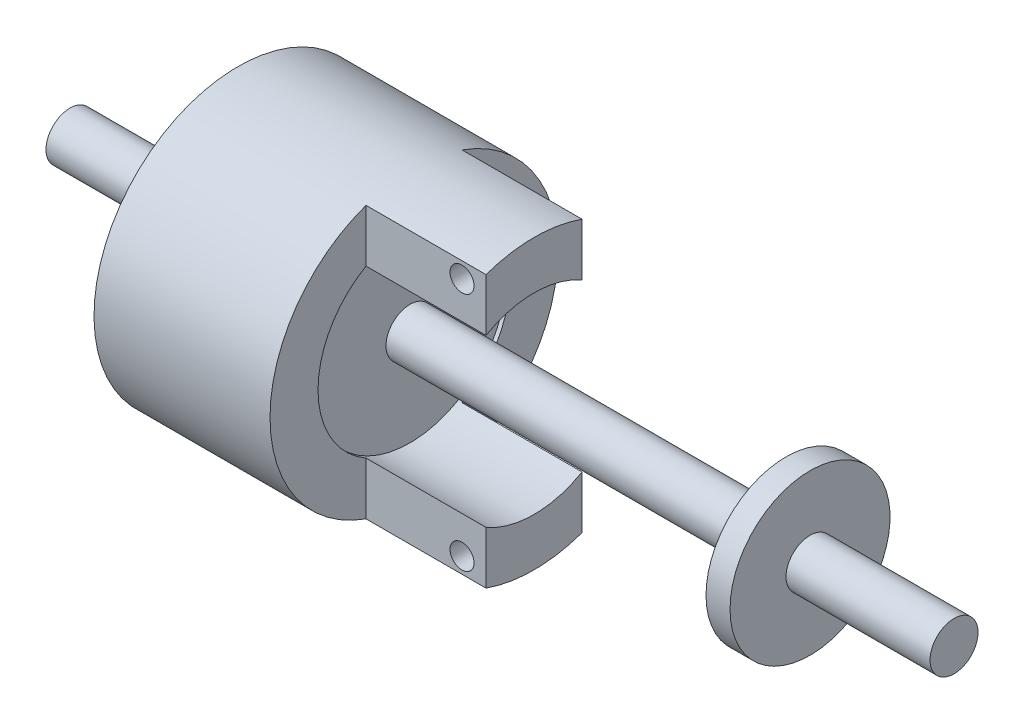
ISO-10303-21;
HEADER;
FILE_DESCRIPTION(('STEP AP214'),'2;1');
FILE_NAME('part.step','',(''),(''),'','','');
FILE_SCHEMA(('AUTOMOTIVE_DESIGN { 1 0 10303 214 1 1 1 1 }'));
ENDSEC;
DATA;
#1=APPLICATION_CONTEXT('core data for automotive mechanical design processes');
#2=APPLICATION_PROTOCOL_DEFINITION('international standard','automotive_design',2000,#1);
#3=PRODUCT_CONTEXT('',#1,'mechanical');
#4=PRODUCT('Part','Part','',(#3));
#5=PRODUCT_RELATED_PRODUCT_CATEGORY('part','',(#4));
#6=PRODUCT_DEFINITION_FORMATION('','',#4);
#7=PRODUCT_DEFINITION_CONTEXT('part definition',#1,'design');
#8=PRODUCT_DEFINITION('design','',#6,#7);
#9=PRODUCT_DEFINITION_SHAPE('','',#8);
#10=(LENGTH_UNIT() NAMED_UNIT(*) SI_UNIT(.MILLI.,.METRE.));
#11=(NAMED_UNIT(*) PLANE_ANGLE_UNIT() SI_UNIT($,.RADIAN.));
#12=(NAMED_UNIT(*) SI_UNIT($,.STERADIAN.) SOLID_ANGLE_UNIT());
#13=UNCERTAINTY_MEASURE_WITH_UNIT(LENGTH_MEASURE(1.E-05),#10,'distance_accuracy_value','');
#14=(GEOMETRIC_REPRESENTATION_CONTEXT(3) GLOBAL_UNCERTAINTY_ASSIGNED_CONTEXT((#13)) GLOBAL_UNIT_ASSIGNED_CONTEXT((#10,
#11,#12)) REPRESENTATION_CONTEXT('',''));
#15=CARTESIAN_POINT('',(0.,0.,0.));
#16=DIRECTION('',(0.,0.,1.));
#17=DIRECTION('',(1.,0.,0.));
#18=AXIS2_PLACEMENT_3D('',#15,#16,#17);
#19=CARTESIAN_POINT('',(-55.,3.,-3.));
#20=DIRECTION('',(-1.,0.,0.));
#21=DIRECTION('',(0.,-1.,0.));
#22=AXIS2_PLACEMENT_3D('',#19,#20,#21);
#23=PLANE('',#22);
#24=CARTESIAN_POINT('',(-55.,0.,0.));
#25=DIRECTION('',(-1.,0.,0.));
#26=DIRECTION('',(0.,0.,1.));
#27=AXIS2_PLACEMENT_3D('',#24,#25,#26);
#28=CIRCLE('',#27,3.);
#29=CARTESIAN_POINT('',(-55.,0.,3.));
#30=VERTEX_POINT('',#29);
#31=EDGE_CURVE('E20',#30,#30,#28,.T.);
#32=ORIENTED_EDGE('',*,*,#31,.T.);
#33=EDGE_LOOP('',(#32));
#34=FACE_BOUND('',#33,.T.);
#35=ADVANCED_FACE('F16',(#34),#23,.T.);
#36=CARTESIAN_POINT('',(-36.,0.,0.));
#37=DIRECTION('',(-1.,0.,0.));
#38=DIRECTION('',(0.,0.,1.));
#39=AXIS2_PLACEMENT_3D('',#36,#37,#38);
#40=CYLINDRICAL_SURFACE('',#39,3.);
#41=CARTESIAN_POINT('',(-36.,0.,0.));
#42=DIRECTION('',(-1.,0.,0.));
#43=DIRECTION('',(0.,0.,1.));
#44=AXIS2_PLACEMENT_3D('',#41,#42,#43);
#45=CIRCLE('',#44,3.);
#46=CARTESIAN_POINT('',(-36.,0.,3.));
#47=VERTEX_POINT('',#46);
#48=EDGE_CURVE('E193',#47,#47,#45,.F.);
#49=ORIENTED_EDGE('',*,*,#48,.F.);
#50=EDGE_LOOP('',(#49));
#51=FACE_BOUND('',#50,.T.);
#52=ORIENTED_EDGE('',*,*,#31,.F.);
#53=EDGE_LOOP('',(#52));
#54=FACE_BOUND('',#53,.T.);
#55=ADVANCED_FACE('F201',(#51,#54),#40,.T.);
#56=CARTESIAN_POINT('',(-36.,4.,-4.));
#57=DIRECTION('',(-1.,0.,0.));
#58=DIRECTION('',(0.,-1.,0.));
#59=AXIS2_PLACEMENT_3D('',#56,#57,#58);
#60=PLANE('',#59);
#61=ORIENTED_EDGE('',*,*,#48,.T.);
#62=EDGE_LOOP('',(#61));
#63=FACE_BOUND('',#62,.T.);
#64=CARTESIAN_POINT('',(-36.,0.,0.));
#65=DIRECTION('',(-1.,0.,0.));
#66=DIRECTION('',(0.,0.,1.));
#67=AXIS2_PLACEMENT_3D('',#64,#65,#66);
#68=CIRCLE('',#67,4.);
#69=CARTESIAN_POINT('',(-36.,0.,4.));
#70=VERTEX_POINT('',#69);
#71=EDGE_CURVE('E190',#70,#70,#68,.T.);
#72=ORIENTED_EDGE('',*,*,#71,.T.);
#73=EDGE_LOOP('',(#72));
#74=FACE_BOUND('',#73,.T.);
#75=ADVANCED_FACE('F203',(#63,#74),#60,.T.);
#76=CARTESIAN_POINT('',(-35.,0.,0.));
#77=DIRECTION('',(-1.,0.,0.));
#78=DIRECTION('',(0.,0.,1.));
#79=AXIS2_PLACEMENT_3D('',#76,#77,#78);
#80=CYLINDRICAL_SURFACE('',#79,4.);
#81=CARTESIAN_POINT('',(-35.,0.,0.));
#82=DIRECTION('',(-1.,0.,0.));
#83=DIRECTION('',(0.,0.,1.));
#84=AXIS2_PLACEMENT_3D('',#81,#82,#83);
#85=CIRCLE('',#84,4.);
#86=CARTESIAN_POINT('',(-35.,0.,4.));
#87=VERTEX_POINT('',#86);
#88=EDGE_CURVE('E187',#87,#87,#85,.F.);
#89=ORIENTED_EDGE('',*,*,#88,.F.);
#90=EDGE_LOOP('',(#89));
#91=FACE_BOUND('',#90,.T.);
#92=ORIENTED_EDGE('',*,*,#71,.F.);
#93=EDGE_LOOP('',(#92));
#94=FACE_BOUND('',#93,.T.);
#95=ADVANCED_FACE('F211',(#91,#94),#80,.T.);
#96=CARTESIAN_POINT('',(-35.,12.,-12.));
#97=DIRECTION('',(-1.,0.,0.));
#98=DIRECTION('',(0.,-1.,0.));
#99=AXIS2_PLACEMENT_3D('',#96,#97,#98);
#100=PLANE('',#99);
#101=ORIENTED_EDGE('',*,*,#88,.T.);
#102=EDGE_LOOP('',(#101));
#103=FACE_BOUND('',#102,.T.);
#104=CARTESIAN_POINT('',(-35.,0.,0.));
#105=DIRECTION('',(1.,0.,0.));
#106=DIRECTION('',(0.,0.,-1.));
#107=AXIS2_PLACEMENT_3D('',#104,#105,#106);
#108=CIRCLE('',#107,12.);
#109=CARTESIAN_POINT('',(-35.,0.,-12.));
#110=VERTEX_POINT('',#109);
#111=EDGE_CURVE('E184',#110,#110,#108,.F.);
#112=ORIENTED_EDGE('',*,*,#111,.T.);
#113=EDGE_LOOP('',(#112));
#114=FACE_BOUND('',#113,.T.);
#115=ADVANCED_FACE('F287',(#103,#114),#100,.T.);
#116=CARTESIAN_POINT('',(-34.,0.,0.));
#117=DIRECTION('',(1.,0.,0.));
#118=DIRECTION('',(0.,0.,-1.));
#119=AXIS2_PLACEMENT_3D('',#116,#117,#118);
#120=CONICAL_SURFACE('',#119,18.,1.40564764938027);
#121=CARTESIAN_POINT('',(-34.,0.,0.));
#122=DIRECTION('',(-1.,0.,0.));
#123=DIRECTION('',(0.,-1.,0.));
#124=AXIS2_PLACEMENT_3D('',#121,#122,#123);
#125=CIRCLE('',#124,18.);
#126=CARTESIAN_POINT('',(-34.,-18.,0.));
#127=VERTEX_POINT('',#126);
#128=EDGE_CURVE('E101',#127,#127,#125,.T.);
#129=ORIENTED_EDGE('',*,*,#128,.T.);
#130=EDGE_LOOP('',(#129));
#131=FACE_BOUND('',#130,.T.);
#132=ORIENTED_EDGE('',*,*,#111,.F.);
#133=EDGE_LOOP('',(#132));
#134=FACE_BOUND('',#133,.T.);
#135=ADVANCED_FACE('F289',(#131,#134),#120,.T.);
#136=CARTESIAN_POINT('',(0.,15.,-6.));
#137=DIRECTION('',(0.,0.,1.));
#138=DIRECTION('',(1.,0.,0.));
#139=AXIS2_PLACEMENT_3D('',#136,#137,#138);
#140=CYLINDRICAL_SURFACE('',#139,1.5);
#141=CARTESIAN_POINT('',(0.,15.,6.));
#142=DIRECTION('',(0.,0.,1.));
#143=DIRECTION('',(1.,0.,0.));
#144=AXIS2_PLACEMENT_3D('',#141,#142,#143);
#145=CIRCLE('',#144,1.5);
#146=CARTESIAN_POINT('',(1.5,15.,6.));
#147=VERTEX_POINT('',#146);
#148=EDGE_CURVE('E139',#147,#147,#145,.T.);
#149=ORIENTED_EDGE('',*,*,#148,.T.);
#150=EDGE_LOOP('',(#149));
#151=FACE_BOUND('',#150,.T.);
#152=CARTESIAN_POINT('',(0.,15.,-6.));
#153=DIRECTION('',(0.,0.,1.));
#154=DIRECTION('',(1.,0.,0.));
#155=AXIS2_PLACEMENT_3D('',#152,#153,#154);
#156=CIRCLE('',#155,1.5);
#157=CARTESIAN_POINT('',(1.5,15.,-6.));
#158=VERTEX_POINT('',#157);
#159=EDGE_CURVE('E116',#158,#158,#156,.F.);
#160=ORIENTED_EDGE('',*,*,#159,.T.);
#161=EDGE_LOOP('',(#160));
#162=FACE_BOUND('',#161,.T.);
#163=ADVANCED_FACE('F300',(#151,#162),#140,.F.);
#164=CARTESIAN_POINT('',(0.,-15.,-6.));
#165=DIRECTION('',(0.,0.,1.));
#166=DIRECTION('',(1.,0.,0.));
#167=AXIS2_PLACEMENT_3D('',#164,#165,#166);
#168=CYLINDRICAL_SURFACE('',#167,1.5);
#169=CARTESIAN_POINT('',(0.,-15.,6.));
#170=DIRECTION('',(0.,0.,1.));
#171=DIRECTION('',(1.,0.,0.));
#172=AXIS2_PLACEMENT_3D('',#169,#170,#171);
#173=CIRCLE('',#172,1.5);
#174=CARTESIAN_POINT('',(1.5,-15.,6.));
#175=VERTEX_POINT('',#174);
#176=EDGE_CURVE('E125',#175,#175,#173,.T.);
#177=ORIENTED_EDGE('',*,*,#176,.T.);
#178=EDGE_LOOP('',(#177));
#179=FACE_BOUND('',#178,.T.);
#180=CARTESIAN_POINT('',(0.,-15.,-6.));
#181=DIRECTION('',(0.,0.,1.));
#182=DIRECTION('',(1.,0.,0.));
#183=AXIS2_PLACEMENT_3D('',#180,#181,#182);
#184=CIRCLE('',#183,1.5);
#185=CARTESIAN_POINT('',(1.5,-15.,-6.));
#186=VERTEX_POINT('',#185);
#187=EDGE_CURVE('E92',#186,#186,#184,.F.);
#188=ORIENTED_EDGE('',*,*,#187,.T.);
#189=EDGE_LOOP('',(#188));
#190=FACE_BOUND('',#189,.T.);
#191=ADVANCED_FACE('F297',(#179,#190),#168,.F.);
#192=CARTESIAN_POINT('',(3.,0.,0.));
#193=DIRECTION('',(-1.,0.,0.));
#194=DIRECTION('',(0.,0.,1.));
#195=AXIS2_PLACEMENT_3D('',#192,#193,#194);
#196=CYLINDRICAL_SURFACE('',#195,18.);
#197=CARTESIAN_POINT('',(3.,0.,0.));
#198=DIRECTION('',(-1.,0.,0.));
#199=DIRECTION('',(0.,0.,1.));
#200=AXIS2_PLACEMENT_3D('',#197,#198,#199);
#201=CIRCLE('',#200,18.);
#202=CARTESIAN_POINT('',(3.,-16.9705627484771,6.));
#203=VERTEX_POINT('',#202);
#204=CARTESIAN_POINT('',(3.,-16.9705627484771,-5.99999999999994));
#205=VERTEX_POINT('',#204);
#206=EDGE_CURVE('E123',#203,#205,#201,.F.);
#207=ORIENTED_EDGE('',*,*,#206,.F.);
#208=DIRECTION('',(-1.,0.,0.));
#209=VECTOR('',#208,1.);
#210=CARTESIAN_POINT('',(-13.970562748477,-16.970562748477,6.));
#211=LINE('',#210,#209);
#212=CARTESIAN_POINT('',(-12.,-16.9705627484771,6.));
#213=VERTEX_POINT('',#212);
#214=EDGE_CURVE('E119',#203,#213,#211,.T.);
#215=ORIENTED_EDGE('',*,*,#214,.T.);
#216=CARTESIAN_POINT('',(-12.0000000000002,0.,0.));
#217=DIRECTION('',(-1.,0.,0.));
#218=DIRECTION('',(0.,0.,1.));
#219=AXIS2_PLACEMENT_3D('',#216,#217,#218);
#220=CIRCLE('',#219,18.);
#221=CARTESIAN_POINT('',(-12.0000000000001,16.9705627484771,6.00000000000009));
#222=VERTEX_POINT('',#221);
#223=EDGE_CURVE('E120',#213,#222,#220,.T.);
#224=ORIENTED_EDGE('',*,*,#223,.T.);
#225=DIRECTION('',(1.,0.,0.));
#226=VECTOR('',#225,1.);
#227=CARTESIAN_POINT('',(-13.970562748477,16.970562748477,6.));
#228=LINE('',#227,#226);
#229=CARTESIAN_POINT('',(3.,16.9705627484771,6.));
#230=VERTEX_POINT('',#229);
#231=EDGE_CURVE('E140',#222,#230,#228,.T.);
#232=ORIENTED_EDGE('',*,*,#231,.T.);
#233=CARTESIAN_POINT('',(3.,0.,0.));
#234=DIRECTION('',(-1.,0.,0.));
#235=DIRECTION('',(0.,0.,1.));
#236=AXIS2_PLACEMENT_3D('',#233,#234,#235);
#237=CIRCLE('',#236,18.);
#238=CARTESIAN_POINT('',(3.,16.9705627484771,-5.99999999999994));
#239=VERTEX_POINT('',#238);
#240=EDGE_CURVE('E115',#239,#230,#237,.F.);
#241=ORIENTED_EDGE('',*,*,#240,.F.);
#242=DIRECTION('',(-1.,0.,0.));
#243=VECTOR('',#242,1.);
#244=CARTESIAN_POINT('',(-13.970562748477,16.970562748477,-6.));
#245=LINE('',#244,#243);
#246=CARTESIAN_POINT('',(-12.,16.9705627484771,-6.));
#247=VERTEX_POINT('',#246);
#248=EDGE_CURVE('E80',#239,#247,#245,.T.);
#249=ORIENTED_EDGE('',*,*,#248,.T.);
#250=CARTESIAN_POINT('',(-12.0000000000002,0.,0.));
#251=DIRECTION('',(-1.,0.,0.));
#252=DIRECTION('',(0.,0.,1.));
#253=AXIS2_PLACEMENT_3D('',#250,#251,#252);
#254=CIRCLE('',#253,18.);
#255=CARTESIAN_POINT('',(-12.0000000000001,-16.970562748477,-6.0000000000001));
#256=VERTEX_POINT('',#255);
#257=EDGE_CURVE('E82',#247,#256,#254,.T.);
#258=ORIENTED_EDGE('',*,*,#257,.T.);
#259=DIRECTION('',(1.,0.,0.));
#260=VECTOR('',#259,1.);
#261=CARTESIAN_POINT('',(-13.970562748477,-16.970562748477,-6.));
#262=LINE('',#261,#260);
#263=EDGE_CURVE('E86',#256,#205,#262,.T.);
#264=ORIENTED_EDGE('',*,*,#263,.T.);
#265=EDGE_LOOP('',(#207,#215,#224,#232,#241,#249,#258,#264));
#266=FACE_BOUND('',#265,.T.);
#267=ORIENTED_EDGE('',*,*,#128,.F.);
#268=EDGE_LOOP('',(#267));
#269=FACE_BOUND('',#268,.T.);
#270=ADVANCED_FACE('F84',(#266,#269),#196,.T.);
#271=CARTESIAN_POINT('',(3.,16.970562748477,-6.));
#272=DIRECTION('',(0.,0.,1.));
#273=DIRECTION('',(-1.,0.,0.));
#274=AXIS2_PLACEMENT_3D('',#271,#272,#273);
#275=PLANE('',#274);
#276=ORIENTED_EDGE('',*,*,#187,.F.);
#277=EDGE_LOOP('',(#276));
#278=FACE_BOUND('',#277,.T.);
#279=ORIENTED_EDGE('',*,*,#263,.F.);
#280=DIRECTION('',(0.,1.,0.));
#281=VECTOR('',#280,1.);
#282=CARTESIAN_POINT('',(-12.,1.029437251523,-6.00000000000013));
#283=LINE('',#282,#281);
#284=CARTESIAN_POINT('',(-11.9999999999998,-10.3923048454133,-6.00000000000006));
#285=VERTEX_POINT('',#284);
#286=EDGE_CURVE('E91',#256,#285,#283,.T.);
#287=ORIENTED_EDGE('',*,*,#286,.T.);
#288=DIRECTION('',(-1.,0.,0.));
#289=VECTOR('',#288,1.);
#290=CARTESIAN_POINT('',(-4.751357719302,-10.3923048454133,-5.99999999999988));
#291=LINE('',#290,#289);
#292=CARTESIAN_POINT('',(3.,-10.3923048454133,-5.99999999999988));
#293=VERTEX_POINT('',#292);
#294=EDGE_CURVE('E122',#293,#285,#291,.T.);
#295=ORIENTED_EDGE('',*,*,#294,.F.);
#296=DIRECTION('',(0.,1.,0.));
#297=VECTOR('',#296,1.);
#298=CARTESIAN_POINT('',(3.,0.,-5.99999999999988));
#299=LINE('',#298,#297);
#300=EDGE_CURVE('E99',#205,#293,#299,.T.);
#301=ORIENTED_EDGE('',*,*,#300,.F.);
#302=EDGE_LOOP('',(#279,#287,#295,#301));
#303=FACE_BOUND('',#302,.T.);
#304=ADVANCED_FACE('F95',(#278,#303),#275,.F.);
#305=CARTESIAN_POINT('',(-12.,-16.970562748477,18.));
#306=DIRECTION('',(-1.,0.,0.));
#307=DIRECTION('',(0.,1.,0.));
#308=AXIS2_PLACEMENT_3D('',#305,#306,#307);
#309=PLANE('',#308);
#310=CARTESIAN_POINT('',(-11.9999999999997,0.,0.));
#311=DIRECTION('',(-1.,0.,0.));
#312=DIRECTION('',(0.,0.,1.));
#313=AXIS2_PLACEMENT_3D('',#310,#311,#312);
#314=CIRCLE('',#313,12.);
#315=CARTESIAN_POINT('',(-11.9999999999997,10.3923048454132,-6.00000000000002));
#316=VERTEX_POINT('',#315);
#317=EDGE_CURVE('E105',#285,#316,#314,.F.);
#318=ORIENTED_EDGE('',*,*,#317,.F.);
#319=ORIENTED_EDGE('',*,*,#286,.F.);
#320=ORIENTED_EDGE('',*,*,#257,.F.);
#321=DIRECTION('',(0.,-1.,0.));
#322=VECTOR('',#321,1.);
#323=CARTESIAN_POINT('',(-11.9999999999998,0.,-6.));
#324=LINE('',#323,#322);
#325=EDGE_CURVE('E108',#247,#316,#324,.T.);
#326=ORIENTED_EDGE('',*,*,#325,.T.);
#327=EDGE_LOOP('',(#318,#319,#320,#326));
#328=FACE_BOUND('',#327,.T.);
#329=ADVANCED_FACE('F103',(#328),#309,.F.);
#330=CARTESIAN_POINT('',(3.,16.970562748477,-6.));
#331=DIRECTION('',(0.,0.,1.));
#332=DIRECTION('',(-1.,0.,0.));
#333=AXIS2_PLACEMENT_3D('',#330,#331,#332);
#334=PLANE('',#333);
#335=ORIENTED_EDGE('',*,*,#159,.F.);
#336=EDGE_LOOP('',(#335));
#337=FACE_BOUND('',#336,.T.);
#338=DIRECTION('',(1.,0.,0.));
#339=VECTOR('',#338,1.);
#340=CARTESIAN_POINT('',(-4.751357719302,10.3923048454132,-6.00000000000008));
#341=LINE('',#340,#339);
#342=CARTESIAN_POINT('',(3.,10.3923048454133,-5.99999999999998));
#343=VERTEX_POINT('',#342);
#344=EDGE_CURVE('E141',#316,#343,#341,.T.);
#345=ORIENTED_EDGE('',*,*,#344,.F.);
#346=ORIENTED_EDGE('',*,*,#325,.F.);
#347=ORIENTED_EDGE('',*,*,#248,.F.);
#348=DIRECTION('',(0.,1.,0.));
#349=VECTOR('',#348,1.);
#350=CARTESIAN_POINT('',(3.,0.545941546018398,-5.99999999999988));
#351=LINE('',#350,#349);
#352=EDGE_CURVE('E112',#343,#239,#351,.T.);
#353=ORIENTED_EDGE('',*,*,#352,.F.);
#354=EDGE_LOOP('',(#345,#346,#347,#353));
#355=FACE_BOUND('',#354,.T.);
#356=ADVANCED_FACE('F278',(#337,#355),#334,.F.);
#357=CARTESIAN_POINT('',(3.,19.0918830920368,6.));
#358=DIRECTION('',(1.,0.,0.));
#359=DIRECTION('',(0.,-1.,0.));
#360=AXIS2_PLACEMENT_3D('',#357,#358,#359);
#361=PLANE('',#360);
#362=ORIENTED_EDGE('',*,*,#240,.T.);
#363=DIRECTION('',(0.,-1.,0.));
#364=VECTOR('',#363,1.);
#365=CARTESIAN_POINT('',(3.,0.,6.));
#366=LINE('',#365,#364);
#367=CARTESIAN_POINT('',(3.,10.3923048454133,5.99999999999997));
#368=VERTEX_POINT('',#367);
#369=EDGE_CURVE('E137',#230,#368,#366,.T.);
#370=ORIENTED_EDGE('',*,*,#369,.T.);
#371=CARTESIAN_POINT('',(3.,0.,0.));
#372=DIRECTION('',(-1.,0.,0.));
#373=DIRECTION('',(0.,0.,1.));
#374=AXIS2_PLACEMENT_3D('',#371,#372,#373);
#375=CIRCLE('',#374,12.);
#376=EDGE_CURVE('E136',#343,#368,#375,.F.);
#377=ORIENTED_EDGE('',*,*,#376,.F.);
#378=ORIENTED_EDGE('',*,*,#352,.T.);
#379=EDGE_LOOP('',(#362,#370,#377,#378));
#380=FACE_BOUND('',#379,.T.);
#381=ADVANCED_FACE('F274',(#380),#361,.T.);
#382=CARTESIAN_POINT('',(3.,-16.970562748477,6.));
#383=DIRECTION('',(0.,0.,-1.));
#384=DIRECTION('',(-1.,0.,0.));
#385=AXIS2_PLACEMENT_3D('',#382,#383,#384);
#386=PLANE('',#385);
#387=ORIENTED_EDGE('',*,*,#148,.F.);
#388=EDGE_LOOP('',(#387));
#389=FACE_BOUND('',#388,.T.);
#390=ORIENTED_EDGE('',*,*,#231,.F.);
#391=DIRECTION('',(0.,-1.,0.));
#392=VECTOR('',#391,1.);
#393=CARTESIAN_POINT('',(-12.,1.029437251523,6.00000000000012));
#394=LINE('',#393,#392);
#395=CARTESIAN_POINT('',(-11.9999999999998,10.3923048454132,6.00000000000007));
#396=VERTEX_POINT('',#395);
#397=EDGE_CURVE('E117',#222,#396,#394,.T.);
#398=ORIENTED_EDGE('',*,*,#397,.T.);
#399=DIRECTION('',(-1.,0.,0.));
#400=VECTOR('',#399,1.);
#401=CARTESIAN_POINT('',(-4.751357719302,10.3923048454133,5.99999999999994));
#402=LINE('',#401,#400);
#403=EDGE_CURVE('E133',#368,#396,#402,.T.);
#404=ORIENTED_EDGE('',*,*,#403,.F.);
#405=ORIENTED_EDGE('',*,*,#369,.F.);
#406=EDGE_LOOP('',(#390,#398,#404,#405));
#407=FACE_BOUND('',#406,.T.);
#408=ADVANCED_FACE('F270',(#389,#407),#386,.F.);
#409=CARTESIAN_POINT('',(-12.,-16.970562748477,54.));
#410=DIRECTION('',(-1.,0.,0.));
#411=DIRECTION('',(0.,1.,0.));
#412=AXIS2_PLACEMENT_3D('',#409,#410,#411);
#413=PLANE('',#412);
#414=CARTESIAN_POINT('',(-11.9999999999997,0.,0.));
#415=DIRECTION('',(-1.,0.,0.));
#416=DIRECTION('',(0.,0.,1.));
#417=AXIS2_PLACEMENT_3D('',#414,#415,#416);
#418=CIRCLE('',#417,12.);
#419=CARTESIAN_POINT('',(-11.9999999999997,-10.3923048454133,6.));
#420=VERTEX_POINT('',#419);
#421=EDGE_CURVE('E130',#396,#420,#418,.F.);
#422=ORIENTED_EDGE('',*,*,#421,.F.);
#423=ORIENTED_EDGE('',*,*,#397,.F.);
#424=ORIENTED_EDGE('',*,*,#223,.F.);
#425=DIRECTION('',(0.,1.,0.));
#426=VECTOR('',#425,1.);
#427=CARTESIAN_POINT('',(-11.9999999999998,0.,6.));
#428=LINE('',#427,#426);
#429=EDGE_CURVE('E131',#213,#420,#428,.T.);
#430=ORIENTED_EDGE('',*,*,#429,.T.);
#431=EDGE_LOOP('',(#422,#423,#424,#430));
#432=FACE_BOUND('',#431,.T.);
#433=ADVANCED_FACE('F266',(#432),#413,.F.);
#434=CARTESIAN_POINT('',(3.,-16.970562748477,6.));
#435=DIRECTION('',(0.,0.,-1.));
#436=DIRECTION('',(-1.,0.,0.));
#437=AXIS2_PLACEMENT_3D('',#434,#435,#436);
#438=PLANE('',#437);
#439=ORIENTED_EDGE('',*,*,#176,.F.);
#440=EDGE_LOOP('',(#439));
#441=FACE_BOUND('',#440,.T.);
#442=DIRECTION('',(1.,0.,0.));
#443=VECTOR('',#442,1.);
#444=CARTESIAN_POINT('',(-4.751357719302,-10.3923048454133,6.00000000000001));
#445=LINE('',#444,#443);
#446=CARTESIAN_POINT('',(3.,-10.3923048454133,6.00000000000001));
#447=VERTEX_POINT('',#446);
#448=EDGE_CURVE('E126',#420,#447,#445,.T.);
#449=ORIENTED_EDGE('',*,*,#448,.F.);
#450=ORIENTED_EDGE('',*,*,#429,.F.);
#451=ORIENTED_EDGE('',*,*,#214,.F.);
#452=DIRECTION('',(0.,-1.,0.));
#453=VECTOR('',#452,1.);
#454=CARTESIAN_POINT('',(3.,0.,6.));
#455=LINE('',#454,#453);
#456=EDGE_CURVE('E35',#447,#203,#455,.T.);
#457=ORIENTED_EDGE('',*,*,#456,.F.);
#458=EDGE_LOOP('',(#449,#450,#451,#457));
#459=FACE_BOUND('',#458,.T.);
#460=ADVANCED_FACE('F262',(#441,#459),#438,.F.);
#461=CARTESIAN_POINT('',(3.,18.,6.));
#462=DIRECTION('',(1.,0.,0.));
#463=DIRECTION('',(0.,-1.,0.));
#464=AXIS2_PLACEMENT_3D('',#461,#462,#463);
#465=PLANE('',#464);
#466=ORIENTED_EDGE('',*,*,#300,.T.);
#467=CARTESIAN_POINT('',(3.,0.,0.));
#468=DIRECTION('',(-1.,0.,0.));
#469=DIRECTION('',(0.,0.,1.));
#470=AXIS2_PLACEMENT_3D('',#467,#468,#469);
#471=CIRCLE('',#470,12.);
#472=EDGE_CURVE('E129',#447,#293,#471,.F.);
#473=ORIENTED_EDGE('',*,*,#472,.F.);
#474=ORIENTED_EDGE('',*,*,#456,.T.);
#475=ORIENTED_EDGE('',*,*,#206,.T.);
#476=EDGE_LOOP('',(#466,#473,#474,#475));
#477=FACE_BOUND('',#476,.T.);
#478=ADVANCED_FACE('F259',(#477),#465,.T.);
#479=CARTESIAN_POINT('',(3.,0.,0.));
#480=DIRECTION('',(-1.,0.,0.));
#481=DIRECTION('',(0.,0.,1.));
#482=AXIS2_PLACEMENT_3D('',#479,#480,#481);
#483=CYLINDRICAL_SURFACE('',#482,12.);
#484=CARTESIAN_POINT('',(-12.502715438604,0.,0.));
#485=DIRECTION('',(-1.,0.,0.));
#486=DIRECTION('',(0.,0.,1.));
#487=AXIS2_PLACEMENT_3D('',#484,#485,#486);
#488=CIRCLE('',#487,12.);
#489=CARTESIAN_POINT('',(-12.502715438604,0.,12.));
#490=VERTEX_POINT('',#489);
#491=EDGE_CURVE('E163',#490,#490,#488,.F.);
#492=ORIENTED_EDGE('',*,*,#491,.F.);
#493=EDGE_LOOP('',(#492));
#494=FACE_BOUND('',#493,.T.);
#495=ORIENTED_EDGE('',*,*,#448,.T.);
#496=ORIENTED_EDGE('',*,*,#472,.T.);
#497=ORIENTED_EDGE('',*,*,#294,.T.);
#498=ORIENTED_EDGE('',*,*,#317,.T.);
#499=ORIENTED_EDGE('',*,*,#344,.T.);
#500=ORIENTED_EDGE('',*,*,#376,.T.);
#501=ORIENTED_EDGE('',*,*,#403,.T.);
#502=ORIENTED_EDGE('',*,*,#421,.T.);
#503=EDGE_LOOP('',(#495,#496,#497,#498,#499,#500,#501,#502));
#504=FACE_BOUND('',#503,.T.);
#505=ADVANCED_FACE('F257',(#494,#504),#483,.F.);
#506=CARTESIAN_POINT('',(-12.502715438604,12.,12.));
#507=DIRECTION('',(1.,0.,0.));
#508=DIRECTION('',(0.,-1.,0.));
#509=AXIS2_PLACEMENT_3D('',#506,#507,#508);
#510=PLANE('',#509);
#511=CARTESIAN_POINT('',(-12.502715438604,0.,0.));
#512=DIRECTION('',(-1.,0.,0.));
#513=DIRECTION('',(0.,0.,1.));
#514=AXIS2_PLACEMENT_3D('',#511,#512,#513);
#515=CIRCLE('',#514,3.);
#516=CARTESIAN_POINT('',(-12.502715438604,0.,3.));
#517=VERTEX_POINT('',#516);
#518=EDGE_CURVE('E160',#517,#517,#515,.T.);
#519=ORIENTED_EDGE('',*,*,#518,.T.);
#520=EDGE_LOOP('',(#519));
#521=FACE_BOUND('',#520,.T.);
#522=ORIENTED_EDGE('',*,*,#491,.T.);
#523=EDGE_LOOP('',(#522));
#524=FACE_BOUND('',#523,.T.);
#525=ADVANCED_FACE('F251',(#521,#524),#510,.T.);
#526=CARTESIAN_POINT('',(34.497284561396,0.,0.));
#527=DIRECTION('',(-1.,0.,0.));
#528=DIRECTION('',(0.,0.,1.));
#529=AXIS2_PLACEMENT_3D('',#526,#527,#528);
#530=CYLINDRICAL_SURFACE('',#529,3.);
#531=CARTESIAN_POINT('',(34.497284561396,0.,0.));
#532=DIRECTION('',(-1.,0.,0.));
#533=DIRECTION('',(0.,0.,1.));
#534=AXIS2_PLACEMENT_3D('',#531,#532,#533);
#535=CIRCLE('',#534,3.);
#536=CARTESIAN_POINT('',(34.497284561396,0.,3.));
#537=VERTEX_POINT('',#536);
#538=EDGE_CURVE('E157',#537,#537,#535,.F.);
#539=ORIENTED_EDGE('',*,*,#538,.F.);
#540=EDGE_LOOP('',(#539));
#541=FACE_BOUND('',#540,.T.);
#542=ORIENTED_EDGE('',*,*,#518,.F.);
#543=EDGE_LOOP('',(#542));
#544=FACE_BOUND('',#543,.T.);
#545=ADVANCED_FACE('F244',(#541,#544),#530,.T.);
#546=CARTESIAN_POINT('',(34.497284561396,10.,-10.));
#547=DIRECTION('',(-1.,0.,0.));
#548=DIRECTION('',(0.,-1.,0.));
#549=AXIS2_PLACEMENT_3D('',#546,#547,#548);
#550=PLANE('',#549);
#551=ORIENTED_EDGE('',*,*,#538,.T.);
#552=EDGE_LOOP('',(#551));
#553=FACE_BOUND('',#552,.T.);
#554=CARTESIAN_POINT('',(34.497284561396,0.,0.));
#555=DIRECTION('',(-1.,0.,0.));
#556=DIRECTION('',(0.,0.,1.));
#557=AXIS2_PLACEMENT_3D('',#554,#555,#556);
#558=CIRCLE('',#557,10.);
#559=CARTESIAN_POINT('',(34.497284561396,0.,10.));
#560=VERTEX_POINT('',#559);
#561=EDGE_CURVE('E153',#560,#560,#558,.T.);
#562=ORIENTED_EDGE('',*,*,#561,.T.);
#563=EDGE_LOOP('',(#562));
#564=FACE_BOUND('',#563,.T.);
#565=ADVANCED_FACE('F239',(#553,#564),#550,.T.);
#566=CARTESIAN_POINT('',(37.497284561396,0.,0.));
#567=DIRECTION('',(-1.,0.,0.));
#568=DIRECTION('',(0.,0.,1.));
#569=AXIS2_PLACEMENT_3D('',#566,#567,#568);
#570=CYLINDRICAL_SURFACE('',#569,10.);
#571=CARTESIAN_POINT('',(37.497284561396,0.,0.));
#572=DIRECTION('',(-1.,0.,0.));
#573=DIRECTION('',(0.,0.,1.));
#574=AXIS2_PLACEMENT_3D('',#571,#572,#573);
#575=CIRCLE('',#574,10.);
#576=CARTESIAN_POINT('',(37.497284561396,0.,10.));
#577=VERTEX_POINT('',#576);
#578=EDGE_CURVE('E150',#577,#577,#575,.F.);
#579=ORIENTED_EDGE('',*,*,#578,.F.);
#580=EDGE_LOOP('',(#579));
#581=FACE_BOUND('',#580,.T.);
#582=ORIENTED_EDGE('',*,*,#561,.F.);
#583=EDGE_LOOP('',(#582));
#584=FACE_BOUND('',#583,.T.);
#585=ADVANCED_FACE('F234',(#581,#584),#570,.T.);
#586=CARTESIAN_POINT('',(37.497284561396,10.,10.));
#587=DIRECTION('',(1.,0.,0.));
#588=DIRECTION('',(0.,-1.,0.));
#589=AXIS2_PLACEMENT_3D('',#586,#587,#588);
#590=PLANE('',#589);
#591=CARTESIAN_POINT('',(37.497284561396,0.,0.));
#592=DIRECTION('',(-1.,0.,0.));
#593=DIRECTION('',(0.,0.,1.));
#594=AXIS2_PLACEMENT_3D('',#591,#592,#593);
#595=CIRCLE('',#594,3.);
#596=CARTESIAN_POINT('',(37.497284561396,0.,2.99999999999998));
#597=VERTEX_POINT('',#596);
#598=EDGE_CURVE('E26',#597,#597,#595,.T.);
#599=ORIENTED_EDGE('',*,*,#598,.T.);
#600=EDGE_LOOP('',(#599));
#601=FACE_BOUND('',#600,.T.);
#602=ORIENTED_EDGE('',*,*,#578,.T.);
#603=EDGE_LOOP('',(#602));
#604=FACE_BOUND('',#603,.T.);
#605=ADVANCED_FACE('F225',(#601,#604),#590,.T.);
#606=CARTESIAN_POINT('',(55.497284561396,0.,0.));
#607=DIRECTION('',(-1.,0.,0.));
#608=DIRECTION('',(0.,0.,1.));
#609=AXIS2_PLACEMENT_3D('',#606,#607,#608);
#610=CYLINDRICAL_SURFACE('',#609,3.);
#611=CARTESIAN_POINT('',(55.497284561396,0.,0.));
#612=DIRECTION('',(-1.,0.,0.));
#613=DIRECTION('',(0.,0.,1.));
#614=AXIS2_PLACEMENT_3D('',#611,#612,#613);
#615=CIRCLE('',#614,3.);
#616=CARTESIAN_POINT('',(55.497284561396,0.,3.));
#617=VERTEX_POINT('',#616);
#618=EDGE_CURVE('E11',#617,#617,#615,.F.);
#619=ORIENTED_EDGE('',*,*,#618,.F.);
#620=EDGE_LOOP('',(#619));
#621=FACE_BOUND('',#620,.T.);
#622=ORIENTED_EDGE('',*,*,#598,.F.);
#623=EDGE_LOOP('',(#622));
#624=FACE_BOUND('',#623,.T.);
#625=ADVANCED_FACE('F217',(#621,#624),#610,.T.);
#626=CARTESIAN_POINT('',(55.497284561396,3.,3.));
#627=DIRECTION('',(1.,0.,0.));
#628=DIRECTION('',(0.,-1.,0.));
#629=AXIS2_PLACEMENT_3D('',#626,#627,#628);
#630=PLANE('',#629);
#631=ORIENTED_EDGE('',*,*,#618,.T.);
#632=EDGE_LOOP('',(#631));
#633=FACE_BOUND('',#632,.T.);
#634=ADVANCED_FACE('F18',(#633),#630,.T.);
#635=CLOSED_SHELL('',(#35,#55,#75,#95,#115,#135,#163,#191,#270,#304,#329,#356,#381,#408,#433,
#460,#478,#505,#525,#545,#565,#585,#605,#625,#634));
#636=MANIFOLD_SOLID_BREP('B1',#635);
#637=ADVANCED_BREP_SHAPE_REPRESENTATION('',(#18,#636),#14);
#638=SHAPE_DEFINITION_REPRESENTATION(#9,#637);
ENDSEC;
END-ISO-10303-21;
